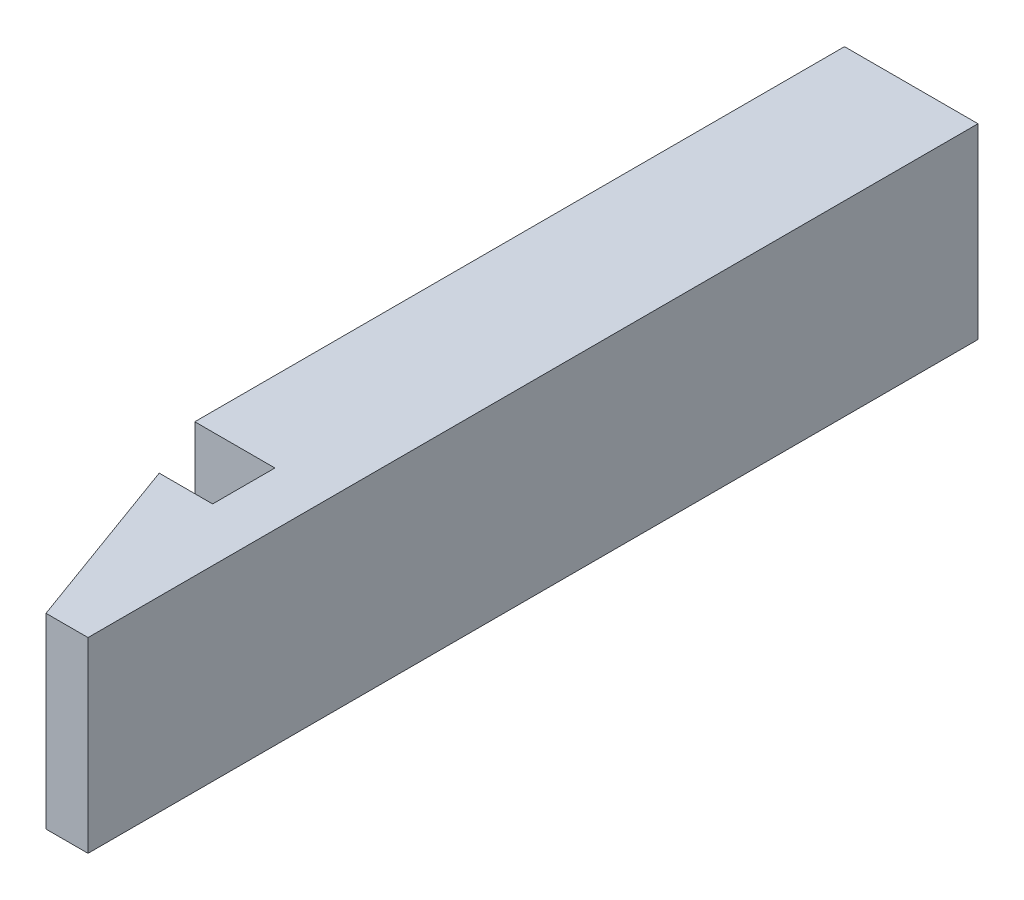
ISO-10303-21;
HEADER;
FILE_DESCRIPTION(('STEP AP214'),'2;1');
FILE_NAME('part.step','',(''),(''),'','','');
FILE_SCHEMA(('AUTOMOTIVE_DESIGN { 1 0 10303 214 1 1 1 1 }'));
ENDSEC;
DATA;
#1=APPLICATION_CONTEXT('core data for automotive mechanical design processes');
#2=APPLICATION_PROTOCOL_DEFINITION('international standard','automotive_design',2000,#1);
#3=PRODUCT_CONTEXT('',#1,'mechanical');
#4=PRODUCT('Part','Part','',(#3));
#5=PRODUCT_RELATED_PRODUCT_CATEGORY('part','',(#4));
#6=PRODUCT_DEFINITION_FORMATION('','',#4);
#7=PRODUCT_DEFINITION_CONTEXT('part definition',#1,'design');
#8=PRODUCT_DEFINITION('design','',#6,#7);
#9=PRODUCT_DEFINITION_SHAPE('','',#8);
#10=(LENGTH_UNIT() NAMED_UNIT(*) SI_UNIT(.MILLI.,.METRE.));
#11=(NAMED_UNIT(*) PLANE_ANGLE_UNIT() SI_UNIT($,.RADIAN.));
#12=(NAMED_UNIT(*) SI_UNIT($,.STERADIAN.) SOLID_ANGLE_UNIT());
#13=UNCERTAINTY_MEASURE_WITH_UNIT(LENGTH_MEASURE(1.E-05),#10,'distance_accuracy_value','');
#14=(GEOMETRIC_REPRESENTATION_CONTEXT(3) GLOBAL_UNCERTAINTY_ASSIGNED_CONTEXT((#13)) GLOBAL_UNIT_ASSIGNED_CONTEXT((#10,
#11,#12)) REPRESENTATION_CONTEXT('',''));
#15=CARTESIAN_POINT('',(0.,0.,0.));
#16=DIRECTION('',(0.,0.,1.));
#17=DIRECTION('',(1.,0.,0.));
#18=AXIS2_PLACEMENT_3D('',#15,#16,#17);
#19=CARTESIAN_POINT('',(0.,5.334,0.));
#20=DIRECTION('',(1.,0.,0.));
#21=DIRECTION('',(0.,0.,-1.));
#22=AXIS2_PLACEMENT_3D('',#19,#20,#21);
#23=PLANE('',#22);
#24=DIRECTION('',(0.,1.,0.));
#25=VECTOR('',#24,1.);
#26=CARTESIAN_POINT('',(0.,0.,-6.858));
#27=LINE('',#26,#25);
#28=CARTESIAN_POINT('',(0.,0.,-6.858));
#29=VERTEX_POINT('',#28);
#30=CARTESIAN_POINT('',(0.,5.334,-6.858));
#31=VERTEX_POINT('',#30);
#32=EDGE_CURVE('E108',#29,#31,#27,.T.);
#33=ORIENTED_EDGE('',*,*,#32,.T.);
#34=DIRECTION('',(0.,0.,1.));
#35=VECTOR('',#34,1.);
#36=CARTESIAN_POINT('',(0.,5.334,0.));
#37=LINE('',#36,#35);
#38=CARTESIAN_POINT('',(0.,5.334,-25.4));
#39=VERTEX_POINT('',#38);
#40=EDGE_CURVE('E141',#39,#31,#37,.T.);
#41=ORIENTED_EDGE('',*,*,#40,.F.);
#42=DIRECTION('',(0.,-1.,0.));
#43=VECTOR('',#42,1.);
#44=CARTESIAN_POINT('',(0.,5.334,-25.4));
#45=LINE('',#44,#43);
#46=CARTESIAN_POINT('',(0.,0.,-25.4));
#47=VERTEX_POINT('',#46);
#48=EDGE_CURVE('E129',#39,#47,#45,.T.);
#49=ORIENTED_EDGE('',*,*,#48,.T.);
#50=DIRECTION('',(0.,0.,1.));
#51=VECTOR('',#50,1.);
#52=CARTESIAN_POINT('',(0.,0.,0.));
#53=LINE('',#52,#51);
#54=EDGE_CURVE('E124',#47,#29,#53,.T.);
#55=ORIENTED_EDGE('',*,*,#54,.T.);
#56=EDGE_LOOP('',(#33,#41,#49,#55));
#57=FACE_BOUND('',#56,.T.);
#58=ADVANCED_FACE('F34',(#57),#23,.F.);
#59=CARTESIAN_POINT('',(0.,5.334,0.));
#60=DIRECTION('',(0.,0.,-1.));
#61=DIRECTION('',(-1.,0.,0.));
#62=AXIS2_PLACEMENT_3D('',#59,#60,#61);
#63=PLANE('',#62);
#64=DIRECTION('',(0.,1.,0.));
#65=VECTOR('',#64,1.);
#66=CARTESIAN_POINT('',(2.6109687900723,0.,0.));
#67=LINE('',#66,#65);
#68=CARTESIAN_POINT('',(2.6109687900723,0.,0.));
#69=VERTEX_POINT('',#68);
#70=CARTESIAN_POINT('',(2.6109687900723,5.334,0.));
#71=VERTEX_POINT('',#70);
#72=EDGE_CURVE('E119',#69,#71,#67,.T.);
#73=ORIENTED_EDGE('',*,*,#72,.F.);
#74=DIRECTION('',(1.,0.,0.));
#75=VECTOR('',#74,1.);
#76=CARTESIAN_POINT('',(0.,0.,0.));
#77=LINE('',#76,#75);
#78=CARTESIAN_POINT('',(3.81000000000001,0.,0.));
#79=VERTEX_POINT('',#78);
#80=EDGE_CURVE('E130',#69,#79,#77,.T.);
#81=ORIENTED_EDGE('',*,*,#80,.T.);
#82=DIRECTION('',(0.,-1.,0.));
#83=VECTOR('',#82,1.);
#84=CARTESIAN_POINT('',(3.81000000000001,5.334,0.));
#85=LINE('',#84,#83);
#86=CARTESIAN_POINT('',(3.81000000000001,5.334,0.));
#87=VERTEX_POINT('',#86);
#88=EDGE_CURVE('E12',#87,#79,#85,.T.);
#89=ORIENTED_EDGE('',*,*,#88,.F.);
#90=DIRECTION('',(1.,0.,0.));
#91=VECTOR('',#90,1.);
#92=CARTESIAN_POINT('',(0.,5.334,0.));
#93=LINE('',#92,#91);
#94=EDGE_CURVE('E79',#71,#87,#93,.T.);
#95=ORIENTED_EDGE('',*,*,#94,.F.);
#96=EDGE_LOOP('',(#73,#81,#89,#95));
#97=FACE_BOUND('',#96,.T.);
#98=ADVANCED_FACE('F153',(#97),#63,.F.);
#99=CARTESIAN_POINT('',(0.,5.334,0.));
#100=DIRECTION('',(0.,-1.,0.));
#101=DIRECTION('',(0.,0.,-1.));
#102=AXIS2_PLACEMENT_3D('',#99,#100,#101);
#103=PLANE('',#102);
#104=DIRECTION('',(1.,0.,0.));
#105=VECTOR('',#104,1.);
#106=CARTESIAN_POINT('',(0.,5.334,-6.858));
#107=LINE('',#106,#105);
#108=CARTESIAN_POINT('',(2.28600000000001,5.334,-6.858));
#109=VERTEX_POINT('',#108);
#110=EDGE_CURVE('E114',#31,#109,#107,.T.);
#111=ORIENTED_EDGE('',*,*,#110,.T.);
#112=DIRECTION('',(0.,0.,1.));
#113=VECTOR('',#112,1.);
#114=CARTESIAN_POINT('',(2.28600000000001,5.334,-6.858));
#115=LINE('',#114,#113);
#116=CARTESIAN_POINT('',(2.28600000000002,5.334,-5.08));
#117=VERTEX_POINT('',#116);
#118=EDGE_CURVE('E238',#109,#117,#115,.T.);
#119=ORIENTED_EDGE('',*,*,#118,.T.);
#120=DIRECTION('',(-1.,0.,0.));
#121=VECTOR('',#120,1.);
#122=CARTESIAN_POINT('',(2.28600000000002,5.334,-5.08));
#123=LINE('',#122,#121);
#124=CARTESIAN_POINT('',(0.761999999999987,5.334,-5.08));
#125=VERTEX_POINT('',#124);
#126=EDGE_CURVE('E234',#117,#125,#123,.T.);
#127=ORIENTED_EDGE('',*,*,#126,.T.);
#128=DIRECTION('',(0.34202014332567,0.,0.939692620785908));
#129=VECTOR('',#128,1.);
#130=CARTESIAN_POINT('',(0.761999999999986,5.334,-5.08));
#131=LINE('',#130,#129);
#132=EDGE_CURVE('E232',#125,#71,#131,.T.);
#133=ORIENTED_EDGE('',*,*,#132,.T.);
#134=ORIENTED_EDGE('',*,*,#94,.T.);
#135=DIRECTION('',(0.,0.,-1.));
#136=VECTOR('',#135,1.);
#137=CARTESIAN_POINT('',(3.81000000000001,5.334,0.));
#138=LINE('',#137,#136);
#139=CARTESIAN_POINT('',(3.80999999999999,5.334,-25.4));
#140=VERTEX_POINT('',#139);
#141=EDGE_CURVE('E150',#87,#140,#138,.T.);
#142=ORIENTED_EDGE('',*,*,#141,.T.);
#143=DIRECTION('',(-1.,0.,0.));
#144=VECTOR('',#143,1.);
#145=CARTESIAN_POINT('',(0.,5.334,-25.4));
#146=LINE('',#145,#144);
#147=EDGE_CURVE('E57',#140,#39,#146,.T.);
#148=ORIENTED_EDGE('',*,*,#147,.T.);
#149=ORIENTED_EDGE('',*,*,#40,.T.);
#150=EDGE_LOOP('',(#111,#119,#127,#133,#134,#142,#148,#149));
#151=FACE_BOUND('',#150,.T.);
#152=ADVANCED_FACE('F162',(#151),#103,.F.);
#153=CARTESIAN_POINT('',(0.,0.,0.));
#154=DIRECTION('',(0.,-1.,0.));
#155=DIRECTION('',(0.,0.,-1.));
#156=AXIS2_PLACEMENT_3D('',#153,#154,#155);
#157=PLANE('',#156);
#158=DIRECTION('',(0.,0.,1.));
#159=VECTOR('',#158,1.);
#160=CARTESIAN_POINT('',(2.28600000000001,0.,-6.858));
#161=LINE('',#160,#159);
#162=CARTESIAN_POINT('',(2.28600000000001,0.,-6.858));
#163=VERTEX_POINT('',#162);
#164=CARTESIAN_POINT('',(2.28600000000002,0.,-5.08));
#165=VERTEX_POINT('',#164);
#166=EDGE_CURVE('E126',#163,#165,#161,.T.);
#167=ORIENTED_EDGE('',*,*,#166,.F.);
#168=DIRECTION('',(1.,0.,0.));
#169=VECTOR('',#168,1.);
#170=CARTESIAN_POINT('',(0.,0.,-6.858));
#171=LINE('',#170,#169);
#172=EDGE_CURVE('E111',#29,#163,#171,.T.);
#173=ORIENTED_EDGE('',*,*,#172,.F.);
#174=ORIENTED_EDGE('',*,*,#54,.F.);
#175=DIRECTION('',(-1.,0.,0.));
#176=VECTOR('',#175,1.);
#177=CARTESIAN_POINT('',(0.,0.,-25.4));
#178=LINE('',#177,#176);
#179=CARTESIAN_POINT('',(3.80999999999999,0.,-25.4));
#180=VERTEX_POINT('',#179);
#181=EDGE_CURVE('E74',#180,#47,#178,.T.);
#182=ORIENTED_EDGE('',*,*,#181,.F.);
#183=DIRECTION('',(0.,0.,-1.));
#184=VECTOR('',#183,1.);
#185=CARTESIAN_POINT('',(3.81000000000001,0.,0.));
#186=LINE('',#185,#184);
#187=EDGE_CURVE('E133',#79,#180,#186,.T.);
#188=ORIENTED_EDGE('',*,*,#187,.F.);
#189=ORIENTED_EDGE('',*,*,#80,.F.);
#190=DIRECTION('',(0.34202014332567,0.,0.939692620785908));
#191=VECTOR('',#190,1.);
#192=CARTESIAN_POINT('',(0.761999999999986,0.,-5.08));
#193=LINE('',#192,#191);
#194=CARTESIAN_POINT('',(0.761999999999987,0.,-5.08));
#195=VERTEX_POINT('',#194);
#196=EDGE_CURVE('E127',#195,#69,#193,.T.);
#197=ORIENTED_EDGE('',*,*,#196,.F.);
#198=DIRECTION('',(-1.,0.,0.));
#199=VECTOR('',#198,1.);
#200=CARTESIAN_POINT('',(2.28600000000002,0.,-5.08));
#201=LINE('',#200,#199);
#202=EDGE_CURVE('E48',#165,#195,#201,.T.);
#203=ORIENTED_EDGE('',*,*,#202,.F.);
#204=EDGE_LOOP('',(#167,#173,#174,#182,#188,#189,#197,#203));
#205=FACE_BOUND('',#204,.T.);
#206=ADVANCED_FACE('F123',(#205),#157,.T.);
#207=CARTESIAN_POINT('',(3.81000000000001,5.334,0.));
#208=DIRECTION('',(-1.,0.,0.));
#209=DIRECTION('',(0.,0.,1.));
#210=AXIS2_PLACEMENT_3D('',#207,#208,#209);
#211=PLANE('',#210);
#212=ORIENTED_EDGE('',*,*,#187,.T.);
#213=DIRECTION('',(0.,-1.,0.));
#214=VECTOR('',#213,1.);
#215=CARTESIAN_POINT('',(3.80999999999999,5.334,-25.4));
#216=LINE('',#215,#214);
#217=EDGE_CURVE('E41',#140,#180,#216,.T.);
#218=ORIENTED_EDGE('',*,*,#217,.F.);
#219=ORIENTED_EDGE('',*,*,#141,.F.);
#220=ORIENTED_EDGE('',*,*,#88,.T.);
#221=EDGE_LOOP('',(#212,#218,#219,#220));
#222=FACE_BOUND('',#221,.T.);
#223=ADVANCED_FACE('F149',(#222),#211,.F.);
#224=CARTESIAN_POINT('',(0.,5.334,-25.4));
#225=DIRECTION('',(0.,0.,1.));
#226=DIRECTION('',(1.,0.,0.));
#227=AXIS2_PLACEMENT_3D('',#224,#225,#226);
#228=PLANE('',#227);
#229=ORIENTED_EDGE('',*,*,#181,.T.);
#230=ORIENTED_EDGE('',*,*,#48,.F.);
#231=ORIENTED_EDGE('',*,*,#147,.F.);
#232=ORIENTED_EDGE('',*,*,#217,.T.);
#233=EDGE_LOOP('',(#229,#230,#231,#232));
#234=FACE_BOUND('',#233,.T.);
#235=ADVANCED_FACE('F143',(#234),#228,.F.);
#236=CARTESIAN_POINT('',(2.28600000000002,0.,-5.08));
#237=DIRECTION('',(0.,0.,-1.));
#238=DIRECTION('',(-1.,0.,0.));
#239=AXIS2_PLACEMENT_3D('',#236,#237,#238);
#240=PLANE('',#239);
#241=ORIENTED_EDGE('',*,*,#126,.F.);
#242=DIRECTION('',(0.,1.,0.));
#243=VECTOR('',#242,1.);
#244=CARTESIAN_POINT('',(2.28600000000002,0.,-5.08));
#245=LINE('',#244,#243);
#246=EDGE_CURVE('E131',#165,#117,#245,.T.);
#247=ORIENTED_EDGE('',*,*,#246,.F.);
#248=ORIENTED_EDGE('',*,*,#202,.T.);
#249=DIRECTION('',(0.,1.,0.));
#250=VECTOR('',#249,1.);
#251=CARTESIAN_POINT('',(0.761999999999986,0.,-5.08));
#252=LINE('',#251,#250);
#253=EDGE_CURVE('E156',#195,#125,#252,.T.);
#254=ORIENTED_EDGE('',*,*,#253,.T.);
#255=EDGE_LOOP('',(#241,#247,#248,#254));
#256=FACE_BOUND('',#255,.T.);
#257=ADVANCED_FACE('F197',(#256),#240,.T.);
#258=CARTESIAN_POINT('',(2.28600000000001,0.,-6.858));
#259=DIRECTION('',(-1.,0.,0.));
#260=DIRECTION('',(0.,0.,1.));
#261=AXIS2_PLACEMENT_3D('',#258,#259,#260);
#262=PLANE('',#261);
#263=ORIENTED_EDGE('',*,*,#118,.F.);
#264=DIRECTION('',(0.,1.,0.));
#265=VECTOR('',#264,1.);
#266=CARTESIAN_POINT('',(2.28600000000001,0.,-6.858));
#267=LINE('',#266,#265);
#268=EDGE_CURVE('E118',#163,#109,#267,.T.);
#269=ORIENTED_EDGE('',*,*,#268,.F.);
#270=ORIENTED_EDGE('',*,*,#166,.T.);
#271=ORIENTED_EDGE('',*,*,#246,.T.);
#272=EDGE_LOOP('',(#263,#269,#270,#271));
#273=FACE_BOUND('',#272,.T.);
#274=ADVANCED_FACE('F202',(#273),#262,.T.);
#275=CARTESIAN_POINT('',(0.,0.,-6.858));
#276=DIRECTION('',(0.,0.,1.));
#277=DIRECTION('',(1.,0.,0.));
#278=AXIS2_PLACEMENT_3D('',#275,#276,#277);
#279=PLANE('',#278);
#280=ORIENTED_EDGE('',*,*,#110,.F.);
#281=ORIENTED_EDGE('',*,*,#32,.F.);
#282=ORIENTED_EDGE('',*,*,#172,.T.);
#283=ORIENTED_EDGE('',*,*,#268,.T.);
#284=EDGE_LOOP('',(#280,#281,#282,#283));
#285=FACE_BOUND('',#284,.T.);
#286=ADVANCED_FACE('F110',(#285),#279,.T.);
#287=CARTESIAN_POINT('',(0.761999999999986,0.,-5.08));
#288=DIRECTION('',(-0.939692620785908,0.,0.34202014332567));
#289=DIRECTION('',(0.34202014332567,0.,0.939692620785908));
#290=AXIS2_PLACEMENT_3D('',#287,#288,#289);
#291=PLANE('',#290);
#292=ORIENTED_EDGE('',*,*,#132,.F.);
#293=ORIENTED_EDGE('',*,*,#253,.F.);
#294=ORIENTED_EDGE('',*,*,#196,.T.);
#295=ORIENTED_EDGE('',*,*,#72,.T.);
#296=EDGE_LOOP('',(#292,#293,#294,#295));
#297=FACE_BOUND('',#296,.T.);
#298=ADVANCED_FACE('F220',(#297),#291,.T.);
#299=CLOSED_SHELL('',(#58,#98,#152,#206,#223,#235,#257,#274,#286,#298));
#300=MANIFOLD_SOLID_BREP('B2',#299);
#301=ADVANCED_BREP_SHAPE_REPRESENTATION('',(#18,#300),#14);
#302=SHAPE_DEFINITION_REPRESENTATION(#9,#301);
ENDSEC;
END-ISO-10303-21;
